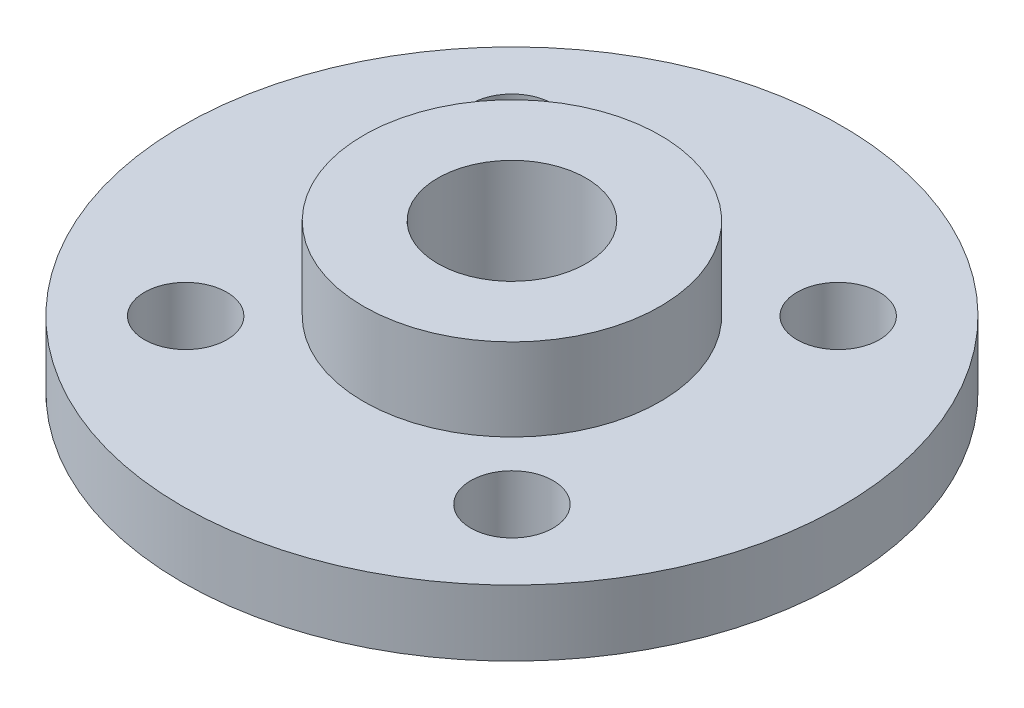
ISO-10303-21;
HEADER;
FILE_DESCRIPTION(('STEP AP214'),'2;1');
FILE_NAME('part.step','',(''),(''),'','','');
FILE_SCHEMA(('AUTOMOTIVE_DESIGN { 1 0 10303 214 1 1 1 1 }'));
ENDSEC;
DATA;
#1=APPLICATION_CONTEXT('core data for automotive mechanical design processes');
#2=APPLICATION_PROTOCOL_DEFINITION('international standard','automotive_design',2000,#1);
#3=PRODUCT_CONTEXT('',#1,'mechanical');
#4=PRODUCT('Part','Part','',(#3));
#5=PRODUCT_RELATED_PRODUCT_CATEGORY('part','',(#4));
#6=PRODUCT_DEFINITION_FORMATION('','',#4);
#7=PRODUCT_DEFINITION_CONTEXT('part definition',#1,'design');
#8=PRODUCT_DEFINITION('design','',#6,#7);
#9=PRODUCT_DEFINITION_SHAPE('','',#8);
#10=(LENGTH_UNIT() NAMED_UNIT(*) SI_UNIT(.MILLI.,.METRE.));
#11=(NAMED_UNIT(*) PLANE_ANGLE_UNIT() SI_UNIT($,.RADIAN.));
#12=(NAMED_UNIT(*) SI_UNIT($,.STERADIAN.) SOLID_ANGLE_UNIT());
#13=UNCERTAINTY_MEASURE_WITH_UNIT(LENGTH_MEASURE(1.E-05),#10,'distance_accuracy_value','');
#14=(GEOMETRIC_REPRESENTATION_CONTEXT(3) GLOBAL_UNCERTAINTY_ASSIGNED_CONTEXT((#13)) GLOBAL_UNIT_ASSIGNED_CONTEXT((#10,
#11,#12)) REPRESENTATION_CONTEXT('',''));
#15=CARTESIAN_POINT('',(0.,0.,0.));
#16=DIRECTION('',(0.,0.,1.));
#17=DIRECTION('',(1.,0.,0.));
#18=AXIS2_PLACEMENT_3D('',#15,#16,#17);
#19=CARTESIAN_POINT('',(0.,2.,0.));
#20=DIRECTION('',(0.,-1.,0.));
#21=DIRECTION('',(0.,0.,-1.));
#22=AXIS2_PLACEMENT_3D('',#19,#20,#21);
#23=CYLINDRICAL_SURFACE('',#22,1.5);
#24=CARTESIAN_POINT('',(0.,0.,0.));
#25=DIRECTION('',(0.,1.,0.));
#26=DIRECTION('',(0.,0.,1.));
#27=AXIS2_PLACEMENT_3D('',#24,#25,#26);
#28=CIRCLE('',#27,1.5);
#29=CARTESIAN_POINT('',(0.,0.,1.5));
#30=VERTEX_POINT('',#29);
#31=EDGE_CURVE('E69',#30,#30,#28,.T.);
#32=ORIENTED_EDGE('',*,*,#31,.F.);
#33=EDGE_LOOP('',(#32));
#34=FACE_BOUND('',#33,.T.);
#35=CARTESIAN_POINT('',(0.,0.900000000000001,0.));
#36=DIRECTION('',(0.,1.,0.));
#37=DIRECTION('',(0.,0.,1.));
#38=AXIS2_PLACEMENT_3D('',#35,#36,#37);
#39=CIRCLE('',#38,1.5);
#40=CARTESIAN_POINT('',(0.,0.900000000000001,1.5));
#41=VERTEX_POINT('',#40);
#42=EDGE_CURVE('E37',#41,#41,#39,.T.);
#43=ORIENTED_EDGE('',*,*,#42,.T.);
#44=EDGE_LOOP('',(#43));
#45=FACE_BOUND('',#44,.T.);
#46=ADVANCED_FACE('F33',(#34,#45),#23,.F.);
#47=CARTESIAN_POINT('',(0.,2.,0.));
#48=DIRECTION('',(0.,1.,0.));
#49=DIRECTION('',(0.,0.,1.));
#50=AXIS2_PLACEMENT_3D('',#47,#48,#49);
#51=PLANE('',#50);
#52=CARTESIAN_POINT('',(4.94974746830583,2.,4.94974746830583));
#53=DIRECTION('',(0.,1.,0.));
#54=DIRECTION('',(0.,0.,1.));
#55=AXIS2_PLACEMENT_3D('',#52,#53,#54);
#56=CIRCLE('',#55,1.25);
#57=CARTESIAN_POINT('',(4.94974746830583,2.,6.19974746830583));
#58=VERTEX_POINT('',#57);
#59=EDGE_CURVE('E57',#58,#58,#56,.T.);
#60=ORIENTED_EDGE('',*,*,#59,.F.);
#61=EDGE_LOOP('',(#60));
#62=FACE_BOUND('',#61,.T.);
#63=CARTESIAN_POINT('',(-4.94974746830583,2.,-4.94974746830583));
#64=DIRECTION('',(0.,1.,0.));
#65=DIRECTION('',(0.,0.,1.));
#66=AXIS2_PLACEMENT_3D('',#63,#64,#65);
#67=CIRCLE('',#66,1.25);
#68=CARTESIAN_POINT('',(-4.94974746830583,2.,-3.69974746830583));
#69=VERTEX_POINT('',#68);
#70=EDGE_CURVE('E46',#69,#69,#67,.T.);
#71=ORIENTED_EDGE('',*,*,#70,.F.);
#72=EDGE_LOOP('',(#71));
#73=FACE_BOUND('',#72,.T.);
#74=CARTESIAN_POINT('',(0.,2.,0.));
#75=DIRECTION('',(0.,1.,0.));
#76=DIRECTION('',(0.,0.,1.));
#77=AXIS2_PLACEMENT_3D('',#74,#75,#76);
#78=CIRCLE('',#77,10.);
#79=CARTESIAN_POINT('',(0.,2.,10.));
#80=VERTEX_POINT('',#79);
#81=EDGE_CURVE('E10',#80,#80,#78,.T.);
#82=ORIENTED_EDGE('',*,*,#81,.T.);
#83=EDGE_LOOP('',(#82));
#84=FACE_BOUND('',#83,.T.);
#85=CARTESIAN_POINT('',(4.94974746830583,2.,-4.94974746830583));
#86=DIRECTION('',(0.,1.,0.));
#87=DIRECTION('',(0.,0.,1.));
#88=AXIS2_PLACEMENT_3D('',#85,#86,#87);
#89=CIRCLE('',#88,1.25);
#90=CARTESIAN_POINT('',(4.94974746830583,2.,-3.69974746830583));
#91=VERTEX_POINT('',#90);
#92=EDGE_CURVE('E51',#91,#91,#89,.T.);
#93=ORIENTED_EDGE('',*,*,#92,.F.);
#94=EDGE_LOOP('',(#93));
#95=FACE_BOUND('',#94,.T.);
#96=CARTESIAN_POINT('',(-4.94974746830583,2.,4.94974746830583));
#97=DIRECTION('',(0.,1.,0.));
#98=DIRECTION('',(0.,0.,1.));
#99=AXIS2_PLACEMENT_3D('',#96,#97,#98);
#100=CIRCLE('',#99,1.25);
#101=CARTESIAN_POINT('',(-4.94974746830583,2.,6.19974746830583));
#102=VERTEX_POINT('',#101);
#103=EDGE_CURVE('E63',#102,#102,#100,.T.);
#104=ORIENTED_EDGE('',*,*,#103,.F.);
#105=EDGE_LOOP('',(#104));
#106=FACE_BOUND('',#105,.T.);
#107=CARTESIAN_POINT('',(0.,2.,0.));
#108=DIRECTION('',(0.,1.,0.));
#109=DIRECTION('',(0.,0.,1.));
#110=AXIS2_PLACEMENT_3D('',#107,#108,#109);
#111=CIRCLE('',#110,4.5);
#112=CARTESIAN_POINT('',(0.,2.,4.5));
#113=VERTEX_POINT('',#112);
#114=EDGE_CURVE('E75',#113,#113,#111,.T.);
#115=ORIENTED_EDGE('',*,*,#114,.F.);
#116=EDGE_LOOP('',(#115));
#117=FACE_BOUND('',#116,.T.);
#118=ADVANCED_FACE('F102',(#62,#73,#84,#95,#106,#117),#51,.T.);
#119=CARTESIAN_POINT('',(0.,0.,0.));
#120=DIRECTION('',(0.,1.,0.));
#121=DIRECTION('',(0.,0.,1.));
#122=AXIS2_PLACEMENT_3D('',#119,#120,#121);
#123=PLANE('',#122);
#124=CARTESIAN_POINT('',(0.,0.,0.));
#125=DIRECTION('',(0.,1.,0.));
#126=DIRECTION('',(0.,0.,1.));
#127=AXIS2_PLACEMENT_3D('',#124,#125,#126);
#128=CIRCLE('',#127,10.);
#129=CARTESIAN_POINT('',(0.,0.,10.));
#130=VERTEX_POINT('',#129);
#131=EDGE_CURVE('E41',#130,#130,#128,.T.);
#132=ORIENTED_EDGE('',*,*,#131,.F.);
#133=EDGE_LOOP('',(#132));
#134=FACE_BOUND('',#133,.T.);
#135=CARTESIAN_POINT('',(-4.94974746830583,0.,-4.94974746830583));
#136=DIRECTION('',(0.,1.,0.));
#137=DIRECTION('',(0.,0.,1.));
#138=AXIS2_PLACEMENT_3D('',#135,#136,#137);
#139=CIRCLE('',#138,1.25);
#140=CARTESIAN_POINT('',(-4.94974746830583,0.,-3.69974746830583));
#141=VERTEX_POINT('',#140);
#142=EDGE_CURVE('E48',#141,#141,#139,.T.);
#143=ORIENTED_EDGE('',*,*,#142,.T.);
#144=EDGE_LOOP('',(#143));
#145=FACE_BOUND('',#144,.T.);
#146=CARTESIAN_POINT('',(4.94974746830583,0.,-4.94974746830583));
#147=DIRECTION('',(0.,1.,0.));
#148=DIRECTION('',(0.,0.,1.));
#149=AXIS2_PLACEMENT_3D('',#146,#147,#148);
#150=CIRCLE('',#149,1.25);
#151=CARTESIAN_POINT('',(4.94974746830583,0.,-3.69974746830583));
#152=VERTEX_POINT('',#151);
#153=EDGE_CURVE('E54',#152,#152,#150,.T.);
#154=ORIENTED_EDGE('',*,*,#153,.T.);
#155=EDGE_LOOP('',(#154));
#156=FACE_BOUND('',#155,.T.);
#157=CARTESIAN_POINT('',(4.94974746830583,0.,4.94974746830583));
#158=DIRECTION('',(0.,1.,0.));
#159=DIRECTION('',(0.,0.,1.));
#160=AXIS2_PLACEMENT_3D('',#157,#158,#159);
#161=CIRCLE('',#160,1.25);
#162=CARTESIAN_POINT('',(4.94974746830583,0.,6.19974746830583));
#163=VERTEX_POINT('',#162);
#164=EDGE_CURVE('E60',#163,#163,#161,.T.);
#165=ORIENTED_EDGE('',*,*,#164,.T.);
#166=EDGE_LOOP('',(#165));
#167=FACE_BOUND('',#166,.T.);
#168=CARTESIAN_POINT('',(-4.94974746830583,0.,4.94974746830583));
#169=DIRECTION('',(0.,1.,0.));
#170=DIRECTION('',(0.,0.,1.));
#171=AXIS2_PLACEMENT_3D('',#168,#169,#170);
#172=CIRCLE('',#171,1.25);
#173=CARTESIAN_POINT('',(-4.94974746830583,0.,6.19974746830583));
#174=VERTEX_POINT('',#173);
#175=EDGE_CURVE('E66',#174,#174,#172,.T.);
#176=ORIENTED_EDGE('',*,*,#175,.T.);
#177=EDGE_LOOP('',(#176));
#178=FACE_BOUND('',#177,.T.);
#179=ORIENTED_EDGE('',*,*,#31,.T.);
#180=EDGE_LOOP('',(#179));
#181=FACE_BOUND('',#180,.T.);
#182=ADVANCED_FACE('F108',(#134,#145,#156,#167,#178,#181),#123,.F.);
#183=CARTESIAN_POINT('',(0.,2.,0.));
#184=DIRECTION('',(0.,-1.,0.));
#185=DIRECTION('',(0.,0.,-1.));
#186=AXIS2_PLACEMENT_3D('',#183,#184,#185);
#187=CYLINDRICAL_SURFACE('',#186,10.);
#188=ORIENTED_EDGE('',*,*,#81,.F.);
#189=EDGE_LOOP('',(#188));
#190=FACE_BOUND('',#189,.T.);
#191=ORIENTED_EDGE('',*,*,#131,.T.);
#192=EDGE_LOOP('',(#191));
#193=FACE_BOUND('',#192,.T.);
#194=ADVANCED_FACE('F35',(#190,#193),#187,.T.);
#195=CARTESIAN_POINT('',(-4.94974746830583,2.,-4.94974746830583));
#196=DIRECTION('',(0.,-1.,0.));
#197=DIRECTION('',(0.,0.,-1.));
#198=AXIS2_PLACEMENT_3D('',#195,#196,#197);
#199=CYLINDRICAL_SURFACE('',#198,1.25);
#200=ORIENTED_EDGE('',*,*,#70,.T.);
#201=EDGE_LOOP('',(#200));
#202=FACE_BOUND('',#201,.T.);
#203=ORIENTED_EDGE('',*,*,#142,.F.);
#204=EDGE_LOOP('',(#203));
#205=FACE_BOUND('',#204,.T.);
#206=ADVANCED_FACE('F127',(#202,#205),#199,.F.);
#207=CARTESIAN_POINT('',(4.94974746830583,2.,-4.94974746830583));
#208=DIRECTION('',(0.,-1.,0.));
#209=DIRECTION('',(0.,0.,-1.));
#210=AXIS2_PLACEMENT_3D('',#207,#208,#209);
#211=CYLINDRICAL_SURFACE('',#210,1.25);
#212=ORIENTED_EDGE('',*,*,#92,.T.);
#213=EDGE_LOOP('',(#212));
#214=FACE_BOUND('',#213,.T.);
#215=ORIENTED_EDGE('',*,*,#153,.F.);
#216=EDGE_LOOP('',(#215));
#217=FACE_BOUND('',#216,.T.);
#218=ADVANCED_FACE('F123',(#214,#217),#211,.F.);
#219=CARTESIAN_POINT('',(4.94974746830583,2.,4.94974746830583));
#220=DIRECTION('',(0.,-1.,0.));
#221=DIRECTION('',(0.,0.,-1.));
#222=AXIS2_PLACEMENT_3D('',#219,#220,#221);
#223=CYLINDRICAL_SURFACE('',#222,1.25);
#224=ORIENTED_EDGE('',*,*,#59,.T.);
#225=EDGE_LOOP('',(#224));
#226=FACE_BOUND('',#225,.T.);
#227=ORIENTED_EDGE('',*,*,#164,.F.);
#228=EDGE_LOOP('',(#227));
#229=FACE_BOUND('',#228,.T.);
#230=ADVANCED_FACE('F119',(#226,#229),#223,.F.);
#231=CARTESIAN_POINT('',(-4.94974746830583,2.,4.94974746830583));
#232=DIRECTION('',(0.,-1.,0.));
#233=DIRECTION('',(0.,0.,-1.));
#234=AXIS2_PLACEMENT_3D('',#231,#232,#233);
#235=CYLINDRICAL_SURFACE('',#234,1.25);
#236=ORIENTED_EDGE('',*,*,#103,.T.);
#237=EDGE_LOOP('',(#236));
#238=FACE_BOUND('',#237,.T.);
#239=ORIENTED_EDGE('',*,*,#175,.F.);
#240=EDGE_LOOP('',(#239));
#241=FACE_BOUND('',#240,.T.);
#242=ADVANCED_FACE('F115',(#238,#241),#235,.F.);
#243=CARTESIAN_POINT('',(0.,4.5,0.));
#244=DIRECTION('',(0.,1.,0.));
#245=DIRECTION('',(0.,0.,1.));
#246=AXIS2_PLACEMENT_3D('',#243,#244,#245);
#247=PLANE('',#246);
#248=CARTESIAN_POINT('',(0.,4.5,0.));
#249=DIRECTION('',(0.,1.,0.));
#250=DIRECTION('',(0.,0.,1.));
#251=AXIS2_PLACEMENT_3D('',#248,#249,#250);
#252=CIRCLE('',#251,2.25);
#253=CARTESIAN_POINT('',(0.,4.5,2.25));
#254=VERTEX_POINT('',#253);
#255=EDGE_CURVE('E80',#254,#254,#252,.T.);
#256=ORIENTED_EDGE('',*,*,#255,.F.);
#257=EDGE_LOOP('',(#256));
#258=FACE_BOUND('',#257,.T.);
#259=CARTESIAN_POINT('',(0.,4.5,0.));
#260=DIRECTION('',(0.,1.,0.));
#261=DIRECTION('',(0.,0.,1.));
#262=AXIS2_PLACEMENT_3D('',#259,#260,#261);
#263=CIRCLE('',#262,4.5);
#264=CARTESIAN_POINT('',(0.,4.5,4.5));
#265=VERTEX_POINT('',#264);
#266=EDGE_CURVE('E74',#265,#265,#263,.T.);
#267=ORIENTED_EDGE('',*,*,#266,.T.);
#268=EDGE_LOOP('',(#267));
#269=FACE_BOUND('',#268,.T.);
#270=ADVANCED_FACE('F118',(#258,#269),#247,.T.);
#271=CARTESIAN_POINT('',(0.,4.5,0.));
#272=DIRECTION('',(0.,-1.,0.));
#273=DIRECTION('',(0.,0.,-1.));
#274=AXIS2_PLACEMENT_3D('',#271,#272,#273);
#275=CYLINDRICAL_SURFACE('',#274,4.5);
#276=ORIENTED_EDGE('',*,*,#266,.F.);
#277=EDGE_LOOP('',(#276));
#278=FACE_BOUND('',#277,.T.);
#279=ORIENTED_EDGE('',*,*,#114,.T.);
#280=EDGE_LOOP('',(#279));
#281=FACE_BOUND('',#280,.T.);
#282=ADVANCED_FACE('F98',(#278,#281),#275,.T.);
#283=CARTESIAN_POINT('',(0.,0.900000000000001,0.));
#284=DIRECTION('',(0.,1.,0.));
#285=DIRECTION('',(0.,0.,1.));
#286=AXIS2_PLACEMENT_3D('',#283,#284,#285);
#287=CYLINDRICAL_SURFACE('',#286,2.25);
#288=CARTESIAN_POINT('',(0.,0.900000000000001,0.));
#289=DIRECTION('',(0.,1.,0.));
#290=DIRECTION('',(0.,0.,1.));
#291=AXIS2_PLACEMENT_3D('',#288,#289,#290);
#292=CIRCLE('',#291,2.25);
#293=CARTESIAN_POINT('',(0.,0.900000000000001,2.25));
#294=VERTEX_POINT('',#293);
#295=EDGE_CURVE('E83',#294,#294,#292,.T.);
#296=ORIENTED_EDGE('',*,*,#295,.F.);
#297=EDGE_LOOP('',(#296));
#298=FACE_BOUND('',#297,.T.);
#299=ORIENTED_EDGE('',*,*,#255,.T.);
#300=EDGE_LOOP('',(#299));
#301=FACE_BOUND('',#300,.T.);
#302=ADVANCED_FACE('F93',(#298,#301),#287,.F.);
#303=CARTESIAN_POINT('',(0.,0.900000000000001,0.));
#304=DIRECTION('',(0.,1.,0.));
#305=DIRECTION('',(0.,0.,1.));
#306=AXIS2_PLACEMENT_3D('',#303,#304,#305);
#307=PLANE('',#306);
#308=ORIENTED_EDGE('',*,*,#42,.F.);
#309=EDGE_LOOP('',(#308));
#310=FACE_BOUND('',#309,.T.);
#311=ORIENTED_EDGE('',*,*,#295,.T.);
#312=EDGE_LOOP('',(#311));
#313=FACE_BOUND('',#312,.T.);
#314=ADVANCED_FACE('F91',(#310,#313),#307,.T.);
#315=CLOSED_SHELL('',(#46,#118,#182,#194,#206,#218,#230,#242,#270,#282,#302,#314));
#316=MANIFOLD_SOLID_BREP('B2',#315);
#317=ADVANCED_BREP_SHAPE_REPRESENTATION('',(#18,#316),#14);
#318=SHAPE_DEFINITION_REPRESENTATION(#9,#317);
ENDSEC;
END-ISO-10303-21;
